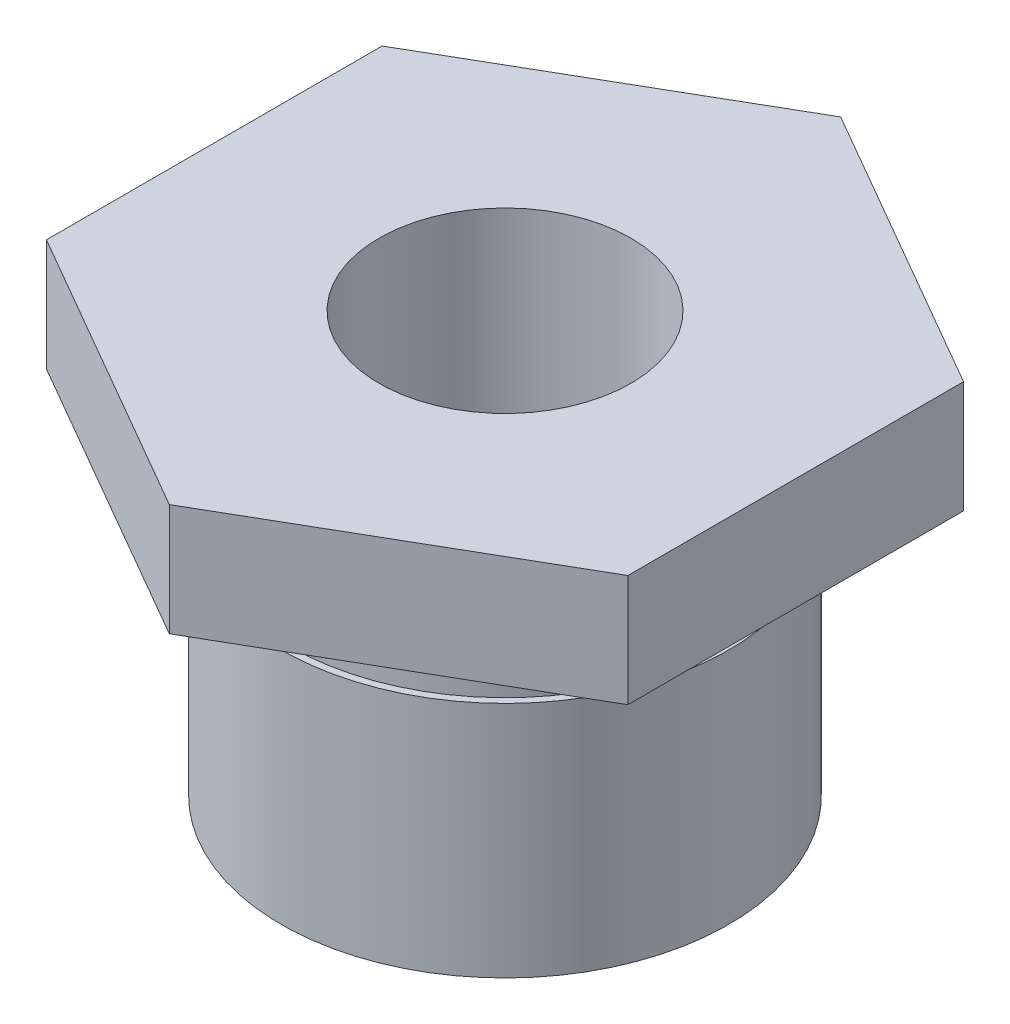
ISO-10303-21;
HEADER;
FILE_DESCRIPTION(('STEP AP214'),'2;1');
FILE_NAME('part.step','',(''),(''),'','','');
FILE_SCHEMA(('AUTOMOTIVE_DESIGN { 1 0 10303 214 1 1 1 1 }'));
ENDSEC;
DATA;
#1=APPLICATION_CONTEXT('core data for automotive mechanical design processes');
#2=APPLICATION_PROTOCOL_DEFINITION('international standard','automotive_design',2000,#1);
#3=PRODUCT_CONTEXT('',#1,'mechanical');
#4=PRODUCT('Part','Part','',(#3));
#5=PRODUCT_RELATED_PRODUCT_CATEGORY('part','',(#4));
#6=PRODUCT_DEFINITION_FORMATION('','',#4);
#7=PRODUCT_DEFINITION_CONTEXT('part definition',#1,'design');
#8=PRODUCT_DEFINITION('design','',#6,#7);
#9=PRODUCT_DEFINITION_SHAPE('','',#8);
#10=(LENGTH_UNIT() NAMED_UNIT(*) SI_UNIT(.MILLI.,.METRE.));
#11=(NAMED_UNIT(*) PLANE_ANGLE_UNIT() SI_UNIT($,.RADIAN.));
#12=(NAMED_UNIT(*) SI_UNIT($,.STERADIAN.) SOLID_ANGLE_UNIT());
#13=UNCERTAINTY_MEASURE_WITH_UNIT(LENGTH_MEASURE(1.E-05),#10,'distance_accuracy_value','');
#14=(GEOMETRIC_REPRESENTATION_CONTEXT(3) GLOBAL_UNCERTAINTY_ASSIGNED_CONTEXT((#13)) GLOBAL_UNIT_ASSIGNED_CONTEXT((#10,
#11,#12)) REPRESENTATION_CONTEXT('',''));
#15=CARTESIAN_POINT('',(0.,0.,0.));
#16=DIRECTION('',(0.,0.,1.));
#17=DIRECTION('',(1.,0.,0.));
#18=AXIS2_PLACEMENT_3D('',#15,#16,#17);
#19=CARTESIAN_POINT('',(-9.,66.9975988700565,0.));
#20=DIRECTION('',(0.,-1.,0.));
#21=DIRECTION('',(0.,0.,-1.));
#22=AXIS2_PLACEMENT_3D('',#19,#20,#21);
#23=PLANE('',#22);
#24=CARTESIAN_POINT('',(0.,66.9975988700565,0.));
#25=DIRECTION('',(0.,-1.,0.));
#26=DIRECTION('',(0.,0.,-1.));
#27=AXIS2_PLACEMENT_3D('',#24,#25,#26);
#28=CIRCLE('',#27,9.);
#29=CARTESIAN_POINT('',(0.,66.9975988700565,-9.));
#30=VERTEX_POINT('',#29);
#31=EDGE_CURVE('E136',#30,#30,#28,.T.);
#32=ORIENTED_EDGE('',*,*,#31,.T.);
#33=EDGE_LOOP('',(#32));
#34=FACE_BOUND('',#33,.T.);
#35=DIRECTION('',(-0.866025403784442,0.,-0.499999999999995));
#36=VECTOR('',#35,1.);
#37=CARTESIAN_POINT('',(20.7846096908264,66.9975988700565,-12.0000000000002));
#38=LINE('',#37,#36);
#39=CARTESIAN_POINT('',(20.7846096908264,66.9975988700565,-12.0000000000002));
#40=VERTEX_POINT('',#39);
#41=CARTESIAN_POINT('',(0.,66.9975988700565,-24.));
#42=VERTEX_POINT('',#41);
#43=EDGE_CURVE('E106',#40,#42,#38,.T.);
#44=ORIENTED_EDGE('',*,*,#43,.T.);
#45=DIRECTION('',(-0.866025403784438,0.,0.500000000000001));
#46=VECTOR('',#45,1.);
#47=CARTESIAN_POINT('',(0.,66.9975988700565,-24.));
#48=LINE('',#47,#46);
#49=CARTESIAN_POINT('',(-20.7846096908266,66.9975988700565,-11.9999999999999));
#50=VERTEX_POINT('',#49);
#51=EDGE_CURVE('E104',#42,#50,#48,.T.);
#52=ORIENTED_EDGE('',*,*,#51,.T.);
#53=DIRECTION('',(0.,0.,1.));
#54=VECTOR('',#53,1.);
#55=CARTESIAN_POINT('',(-20.7846096908266,66.9975988700565,-12.));
#56=LINE('',#55,#54);
#57=CARTESIAN_POINT('',(-20.7846096908265,66.9975988700565,12.0000000000001));
#58=VERTEX_POINT('',#57);
#59=EDGE_CURVE('E47',#50,#58,#56,.T.);
#60=ORIENTED_EDGE('',*,*,#59,.T.);
#61=DIRECTION('',(0.866025403784441,0.,0.499999999999995));
#62=VECTOR('',#61,1.);
#63=CARTESIAN_POINT('',(-20.7846096908265,66.9975988700565,12.0000000000001));
#64=LINE('',#63,#62);
#65=CARTESIAN_POINT('',(1.70067275149718E-13,66.9975988700565,24.));
#66=VERTEX_POINT('',#65);
#67=EDGE_CURVE('E94',#58,#66,#64,.T.);
#68=ORIENTED_EDGE('',*,*,#67,.T.);
#69=DIRECTION('',(0.866025403784435,0.,-0.500000000000007));
#70=VECTOR('',#69,1.);
#71=CARTESIAN_POINT('',(1.70067275149718E-13,66.9975988700565,24.));
#72=LINE('',#71,#70);
#73=CARTESIAN_POINT('',(20.7846096908266,66.9975988700565,11.9999999999998));
#74=VERTEX_POINT('',#73);
#75=EDGE_CURVE('E100',#66,#74,#72,.T.);
#76=ORIENTED_EDGE('',*,*,#75,.T.);
#77=DIRECTION('',(0.,0.,-1.));
#78=VECTOR('',#77,1.);
#79=CARTESIAN_POINT('',(20.7846096908266,66.9975988700565,11.9999999999998));
#80=LINE('',#79,#78);
#81=EDGE_CURVE('E111',#74,#40,#80,.T.);
#82=ORIENTED_EDGE('',*,*,#81,.T.);
#83=EDGE_LOOP('',(#44,#52,#60,#68,#76,#82));
#84=FACE_BOUND('',#83,.T.);
#85=ADVANCED_FACE('F32',(#34,#84),#23,.F.);
#86=CARTESIAN_POINT('',(-24.,58.9975988700565,0.));
#87=DIRECTION('',(0.,1.,0.));
#88=DIRECTION('',(0.,0.,1.));
#89=AXIS2_PLACEMENT_3D('',#86,#87,#88);
#90=PLANE('',#89);
#91=CARTESIAN_POINT('',(0.,58.9975988700565,0.));
#92=DIRECTION('',(0.,-1.,0.));
#93=DIRECTION('',(0.,0.,-1.));
#94=AXIS2_PLACEMENT_3D('',#91,#92,#93);
#95=CIRCLE('',#94,15.5);
#96=CARTESIAN_POINT('',(0.,58.9975988700565,-15.5));
#97=VERTEX_POINT('',#96);
#98=EDGE_CURVE('E133',#97,#97,#95,.T.);
#99=ORIENTED_EDGE('',*,*,#98,.F.);
#100=EDGE_LOOP('',(#99));
#101=FACE_BOUND('',#100,.T.);
#102=DIRECTION('',(-0.866025403784442,0.,-0.499999999999995));
#103=VECTOR('',#102,1.);
#104=CARTESIAN_POINT('',(-7.60769515458693,58.9975988700565,-28.3923048454133));
#105=LINE('',#104,#103);
#106=CARTESIAN_POINT('',(20.7846096908264,58.9975988700565,-12.0000000000002));
#107=VERTEX_POINT('',#106);
#108=CARTESIAN_POINT('',(0.,58.9975988700565,-24.));
#109=VERTEX_POINT('',#108);
#110=EDGE_CURVE('E11',#107,#109,#105,.T.);
#111=ORIENTED_EDGE('',*,*,#110,.F.);
#112=DIRECTION('',(0.,0.,-1.));
#113=VECTOR('',#112,1.);
#114=CARTESIAN_POINT('',(20.7846096908265,58.9975988700565,-4.67286689418279E-13));
#115=LINE('',#114,#113);
#116=CARTESIAN_POINT('',(20.7846096908266,58.9975988700565,11.9999999999998));
#117=VERTEX_POINT('',#116);
#118=EDGE_CURVE('E40',#117,#107,#115,.T.);
#119=ORIENTED_EDGE('',*,*,#118,.F.);
#120=DIRECTION('',(0.866025403784435,0.,-0.500000000000007));
#121=VECTOR('',#120,1.);
#122=CARTESIAN_POINT('',(-7.60769515458643,58.9975988700565,28.3923048454133));
#123=LINE('',#122,#121);
#124=CARTESIAN_POINT('',(1.70067275149718E-13,58.9975988700565,24.));
#125=VERTEX_POINT('',#124);
#126=EDGE_CURVE('E144',#125,#117,#123,.T.);
#127=ORIENTED_EDGE('',*,*,#126,.F.);
#128=DIRECTION('',(0.866025403784442,0.,0.499999999999995));
#129=VECTOR('',#128,1.);
#130=CARTESIAN_POINT('',(-28.3923048454133,58.9975988700565,7.60769515458685));
#131=LINE('',#130,#129);
#132=CARTESIAN_POINT('',(-20.7846096908265,58.9975988700565,12.0000000000001));
#133=VERTEX_POINT('',#132);
#134=EDGE_CURVE('E142',#133,#125,#131,.T.);
#135=ORIENTED_EDGE('',*,*,#134,.F.);
#136=DIRECTION('',(0.,0.,1.));
#137=VECTOR('',#136,1.);
#138=CARTESIAN_POINT('',(-20.7846096908265,58.9975988700565,0.));
#139=LINE('',#138,#137);
#140=CARTESIAN_POINT('',(-20.7846096908266,58.9975988700565,-12.));
#141=VERTEX_POINT('',#140);
#142=EDGE_CURVE('E87',#141,#133,#139,.T.);
#143=ORIENTED_EDGE('',*,*,#142,.F.);
#144=DIRECTION('',(-0.866025403784438,0.,0.500000000000001));
#145=VECTOR('',#144,1.);
#146=CARTESIAN_POINT('',(-28.3923048454133,58.9975988700565,-7.6076951545867));
#147=LINE('',#146,#145);
#148=EDGE_CURVE('E139',#109,#141,#147,.T.);
#149=ORIENTED_EDGE('',*,*,#148,.F.);
#150=EDGE_LOOP('',(#111,#119,#127,#135,#143,#149));
#151=FACE_BOUND('',#150,.T.);
#152=ADVANCED_FACE('F158',(#101,#151),#90,.F.);
#153=CARTESIAN_POINT('',(0.,0.,0.));
#154=DIRECTION('',(0.,-1.,0.));
#155=DIRECTION('',(0.,0.,-1.));
#156=AXIS2_PLACEMENT_3D('',#153,#154,#155);
#157=CYLINDRICAL_SURFACE('',#156,9.);
#158=ORIENTED_EDGE('',*,*,#31,.F.);
#159=EDGE_LOOP('',(#158));
#160=FACE_BOUND('',#159,.T.);
#161=CARTESIAN_POINT('',(0.,36.9975988700565,0.));
#162=DIRECTION('',(0.,-1.,0.));
#163=DIRECTION('',(0.,0.,-1.));
#164=AXIS2_PLACEMENT_3D('',#161,#162,#163);
#165=CIRCLE('',#164,9.);
#166=CARTESIAN_POINT('',(0.,36.9975988700565,-9.));
#167=VERTEX_POINT('',#166);
#168=EDGE_CURVE('E116',#167,#167,#165,.T.);
#169=ORIENTED_EDGE('',*,*,#168,.T.);
#170=EDGE_LOOP('',(#169));
#171=FACE_BOUND('',#170,.T.);
#172=ADVANCED_FACE('F34',(#160,#171),#157,.F.);
#173=CARTESIAN_POINT('',(0.,0.,0.));
#174=DIRECTION('',(0.,-1.,0.));
#175=DIRECTION('',(0.,0.,-1.));
#176=AXIS2_PLACEMENT_3D('',#173,#174,#175);
#177=CYLINDRICAL_SURFACE('',#176,15.5);
#178=CARTESIAN_POINT('',(0.,53.9975988700565,0.));
#179=DIRECTION('',(0.,-1.,0.));
#180=DIRECTION('',(0.,0.,-1.));
#181=AXIS2_PLACEMENT_3D('',#178,#179,#180);
#182=CIRCLE('',#181,15.5);
#183=CARTESIAN_POINT('',(0.,53.9975988700565,-15.5));
#184=VERTEX_POINT('',#183);
#185=EDGE_CURVE('E130',#184,#184,#182,.T.);
#186=ORIENTED_EDGE('',*,*,#185,.F.);
#187=EDGE_LOOP('',(#186));
#188=FACE_BOUND('',#187,.T.);
#189=ORIENTED_EDGE('',*,*,#98,.T.);
#190=EDGE_LOOP('',(#189));
#191=FACE_BOUND('',#190,.T.);
#192=ADVANCED_FACE('F178',(#188,#191),#177,.T.);
#193=CARTESIAN_POINT('',(-15.5,53.9975988700565,0.));
#194=DIRECTION('',(0.,-1.,0.));
#195=DIRECTION('',(0.,0.,-1.));
#196=AXIS2_PLACEMENT_3D('',#193,#194,#195);
#197=PLANE('',#196);
#198=CARTESIAN_POINT('',(0.,53.9975988700565,0.));
#199=DIRECTION('',(0.,-1.,0.));
#200=DIRECTION('',(0.,0.,-1.));
#201=AXIS2_PLACEMENT_3D('',#198,#199,#200);
#202=CIRCLE('',#201,16.);
#203=CARTESIAN_POINT('',(0.,53.9975988700565,-16.));
#204=VERTEX_POINT('',#203);
#205=EDGE_CURVE('E127',#204,#204,#202,.T.);
#206=ORIENTED_EDGE('',*,*,#205,.F.);
#207=EDGE_LOOP('',(#206));
#208=FACE_BOUND('',#207,.T.);
#209=ORIENTED_EDGE('',*,*,#185,.T.);
#210=EDGE_LOOP('',(#209));
#211=FACE_BOUND('',#210,.T.);
#212=ADVANCED_FACE('F181',(#208,#211),#197,.F.);
#213=CARTESIAN_POINT('',(0.,0.,0.));
#214=DIRECTION('',(0.,-1.,0.));
#215=DIRECTION('',(0.,0.,-1.));
#216=AXIS2_PLACEMENT_3D('',#213,#214,#215);
#217=CYLINDRICAL_SURFACE('',#216,16.);
#218=CARTESIAN_POINT('',(0.,36.9975988700565,0.));
#219=DIRECTION('',(0.,-1.,0.));
#220=DIRECTION('',(0.,0.,-1.));
#221=AXIS2_PLACEMENT_3D('',#218,#219,#220);
#222=CIRCLE('',#221,16.);
#223=CARTESIAN_POINT('',(0.,36.9975988700565,-16.));
#224=VERTEX_POINT('',#223);
#225=EDGE_CURVE('E124',#224,#224,#222,.T.);
#226=ORIENTED_EDGE('',*,*,#225,.F.);
#227=EDGE_LOOP('',(#226));
#228=FACE_BOUND('',#227,.T.);
#229=ORIENTED_EDGE('',*,*,#205,.T.);
#230=EDGE_LOOP('',(#229));
#231=FACE_BOUND('',#230,.T.);
#232=ADVANCED_FACE('F185',(#228,#231),#217,.T.);
#233=CARTESIAN_POINT('',(-16.,36.9975988700565,0.));
#234=DIRECTION('',(0.,1.,0.));
#235=DIRECTION('',(0.,0.,1.));
#236=AXIS2_PLACEMENT_3D('',#233,#234,#235);
#237=PLANE('',#236);
#238=ORIENTED_EDGE('',*,*,#168,.F.);
#239=EDGE_LOOP('',(#238));
#240=FACE_BOUND('',#239,.T.);
#241=ORIENTED_EDGE('',*,*,#225,.T.);
#242=EDGE_LOOP('',(#241));
#243=FACE_BOUND('',#242,.T.);
#244=ADVANCED_FACE('F189',(#240,#243),#237,.F.);
#245=CARTESIAN_POINT('',(20.7846096908264,56.9975988700565,-12.0000000000002));
#246=DIRECTION('',(0.499999999999995,0.,-0.866025403784442));
#247=DIRECTION('',(-0.866025403784442,0.,-0.499999999999995));
#248=AXIS2_PLACEMENT_3D('',#245,#246,#247);
#249=PLANE('',#248);
#250=ORIENTED_EDGE('',*,*,#110,.T.);
#251=DIRECTION('',(0.,1.,0.));
#252=VECTOR('',#251,1.);
#253=CARTESIAN_POINT('',(0.,56.9975988700565,-24.));
#254=LINE('',#253,#252);
#255=EDGE_CURVE('E55',#109,#42,#254,.T.);
#256=ORIENTED_EDGE('',*,*,#255,.T.);
#257=ORIENTED_EDGE('',*,*,#43,.F.);
#258=DIRECTION('',(0.,1.,0.));
#259=VECTOR('',#258,1.);
#260=CARTESIAN_POINT('',(20.7846096908264,56.9975988700565,-12.0000000000002));
#261=LINE('',#260,#259);
#262=EDGE_CURVE('E114',#107,#40,#261,.T.);
#263=ORIENTED_EDGE('',*,*,#262,.F.);
#264=EDGE_LOOP('',(#250,#256,#257,#263));
#265=FACE_BOUND('',#264,.T.);
#266=ADVANCED_FACE('F156',(#265),#249,.T.);
#267=CARTESIAN_POINT('',(20.7846096908266,56.9975988700565,11.9999999999998));
#268=DIRECTION('',(1.,0.,0.));
#269=DIRECTION('',(0.,0.,-1.));
#270=AXIS2_PLACEMENT_3D('',#267,#268,#269);
#271=PLANE('',#270);
#272=ORIENTED_EDGE('',*,*,#118,.T.);
#273=ORIENTED_EDGE('',*,*,#262,.T.);
#274=ORIENTED_EDGE('',*,*,#81,.F.);
#275=DIRECTION('',(0.,1.,0.));
#276=VECTOR('',#275,1.);
#277=CARTESIAN_POINT('',(20.7846096908266,56.9975988700565,11.9999999999998));
#278=LINE('',#277,#276);
#279=EDGE_CURVE('E117',#117,#74,#278,.T.);
#280=ORIENTED_EDGE('',*,*,#279,.F.);
#281=EDGE_LOOP('',(#272,#273,#274,#280));
#282=FACE_BOUND('',#281,.T.);
#283=ADVANCED_FACE('F149',(#282),#271,.T.);
#284=CARTESIAN_POINT('',(1.70067275149718E-13,56.9975988700565,24.));
#285=DIRECTION('',(0.500000000000007,0.,0.866025403784435));
#286=DIRECTION('',(0.866025403784435,0.,-0.500000000000007));
#287=AXIS2_PLACEMENT_3D('',#284,#285,#286);
#288=PLANE('',#287);
#289=ORIENTED_EDGE('',*,*,#126,.T.);
#290=ORIENTED_EDGE('',*,*,#279,.T.);
#291=ORIENTED_EDGE('',*,*,#75,.F.);
#292=DIRECTION('',(0.,1.,0.));
#293=VECTOR('',#292,1.);
#294=CARTESIAN_POINT('',(1.70067275149718E-13,56.9975988700565,24.));
#295=LINE('',#294,#293);
#296=EDGE_CURVE('E90',#125,#66,#295,.T.);
#297=ORIENTED_EDGE('',*,*,#296,.F.);
#298=EDGE_LOOP('',(#289,#290,#291,#297));
#299=FACE_BOUND('',#298,.T.);
#300=ADVANCED_FACE('F161',(#299),#288,.T.);
#301=CARTESIAN_POINT('',(-20.7846096908265,56.9975988700565,12.0000000000001));
#302=DIRECTION('',(-0.499999999999995,0.,0.866025403784442));
#303=DIRECTION('',(0.866025403784442,0.,0.499999999999995));
#304=AXIS2_PLACEMENT_3D('',#301,#302,#303);
#305=PLANE('',#304);
#306=ORIENTED_EDGE('',*,*,#134,.T.);
#307=ORIENTED_EDGE('',*,*,#296,.T.);
#308=ORIENTED_EDGE('',*,*,#67,.F.);
#309=DIRECTION('',(0.,1.,0.));
#310=VECTOR('',#309,1.);
#311=CARTESIAN_POINT('',(-20.7846096908265,56.9975988700565,12.0000000000001));
#312=LINE('',#311,#310);
#313=EDGE_CURVE('E83',#133,#58,#312,.T.);
#314=ORIENTED_EDGE('',*,*,#313,.F.);
#315=EDGE_LOOP('',(#306,#307,#308,#314));
#316=FACE_BOUND('',#315,.T.);
#317=ADVANCED_FACE('F95',(#316),#305,.T.);
#318=CARTESIAN_POINT('',(-20.7846096908266,56.9975988700565,-12.));
#319=DIRECTION('',(-1.,0.,0.));
#320=DIRECTION('',(0.,0.,1.));
#321=AXIS2_PLACEMENT_3D('',#318,#319,#320);
#322=PLANE('',#321);
#323=ORIENTED_EDGE('',*,*,#142,.T.);
#324=ORIENTED_EDGE('',*,*,#313,.T.);
#325=ORIENTED_EDGE('',*,*,#59,.F.);
#326=DIRECTION('',(0.,1.,0.));
#327=VECTOR('',#326,1.);
#328=CARTESIAN_POINT('',(-20.7846096908266,56.9975988700565,-12.));
#329=LINE('',#328,#327);
#330=EDGE_CURVE('E91',#141,#50,#329,.T.);
#331=ORIENTED_EDGE('',*,*,#330,.F.);
#332=EDGE_LOOP('',(#323,#324,#325,#331));
#333=FACE_BOUND('',#332,.T.);
#334=ADVANCED_FACE('F85',(#333),#322,.T.);
#335=CARTESIAN_POINT('',(0.,56.9975988700565,-24.));
#336=DIRECTION('',(-0.500000000000001,0.,-0.866025403784438));
#337=DIRECTION('',(-0.866025403784438,0.,0.500000000000001));
#338=AXIS2_PLACEMENT_3D('',#335,#336,#337);
#339=PLANE('',#338);
#340=ORIENTED_EDGE('',*,*,#148,.T.);
#341=ORIENTED_EDGE('',*,*,#330,.T.);
#342=ORIENTED_EDGE('',*,*,#51,.F.);
#343=ORIENTED_EDGE('',*,*,#255,.F.);
#344=EDGE_LOOP('',(#340,#341,#342,#343));
#345=FACE_BOUND('',#344,.T.);
#346=ADVANCED_FACE('F159',(#345),#339,.T.);
#347=CLOSED_SHELL('',(#85,#152,#172,#192,#212,#232,#244,#266,#283,#300,#317,#334,#346));
#348=MANIFOLD_SOLID_BREP('B2',#347);
#349=ADVANCED_BREP_SHAPE_REPRESENTATION('',(#18,#348),#14);
#350=SHAPE_DEFINITION_REPRESENTATION(#9,#349);
ENDSEC;
END-ISO-10303-21;
